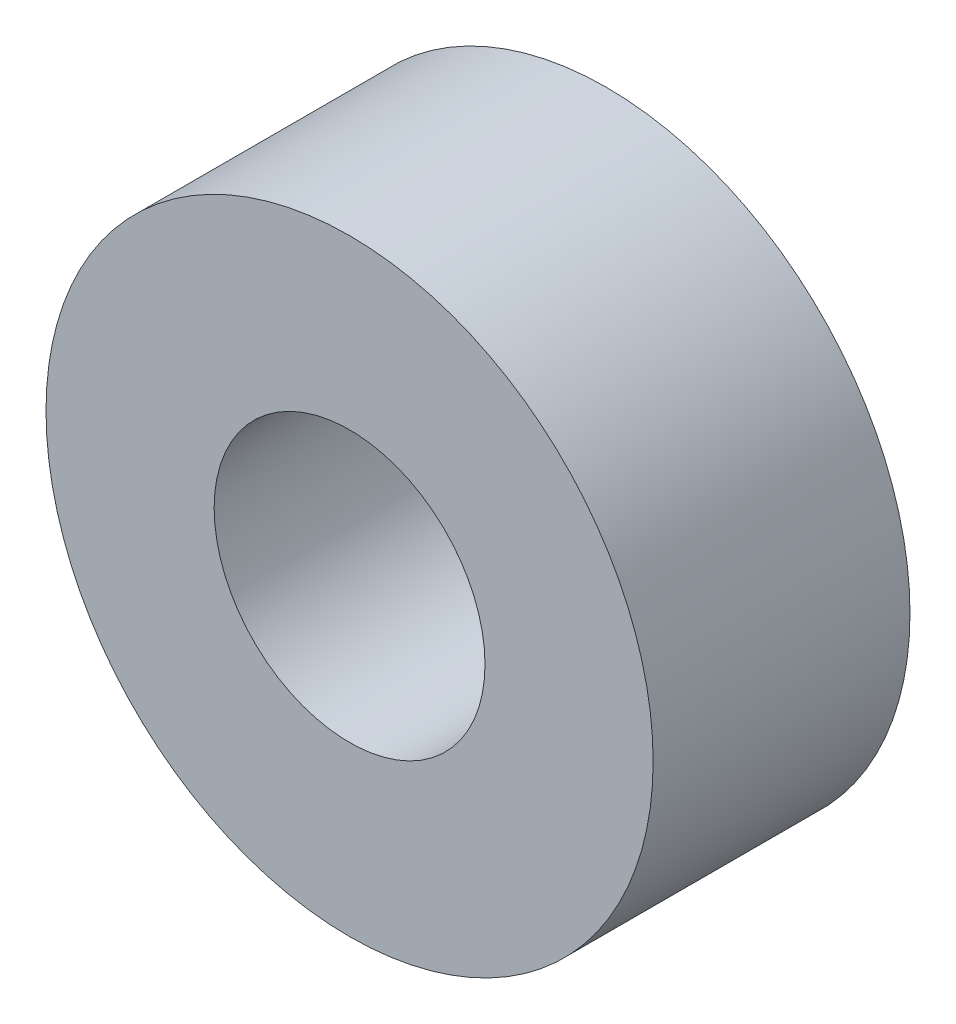
ISO-10303-21;
HEADER;
FILE_DESCRIPTION(('STEP AP214'),'2;1');
FILE_NAME('part.step','',(''),(''),'','','');
FILE_SCHEMA(('AUTOMOTIVE_DESIGN { 1 0 10303 214 1 1 1 1 }'));
ENDSEC;
DATA;
#1=APPLICATION_CONTEXT('core data for automotive mechanical design processes');
#2=APPLICATION_PROTOCOL_DEFINITION('international standard','automotive_design',2000,#1);
#3=PRODUCT_CONTEXT('',#1,'mechanical');
#4=PRODUCT('Part','Part','',(#3));
#5=PRODUCT_RELATED_PRODUCT_CATEGORY('part','',(#4));
#6=PRODUCT_DEFINITION_FORMATION('','',#4);
#7=PRODUCT_DEFINITION_CONTEXT('part definition',#1,'design');
#8=PRODUCT_DEFINITION('design','',#6,#7);
#9=PRODUCT_DEFINITION_SHAPE('','',#8);
#10=(LENGTH_UNIT() NAMED_UNIT(*) SI_UNIT(.MILLI.,.METRE.));
#11=(NAMED_UNIT(*) PLANE_ANGLE_UNIT() SI_UNIT($,.RADIAN.));
#12=(NAMED_UNIT(*) SI_UNIT($,.STERADIAN.) SOLID_ANGLE_UNIT());
#13=UNCERTAINTY_MEASURE_WITH_UNIT(LENGTH_MEASURE(1.E-05),#10,'distance_accuracy_value','');
#14=(GEOMETRIC_REPRESENTATION_CONTEXT(3) GLOBAL_UNCERTAINTY_ASSIGNED_CONTEXT((#13)) GLOBAL_UNIT_ASSIGNED_CONTEXT((#10,
#11,#12)) REPRESENTATION_CONTEXT('',''));
#15=CARTESIAN_POINT('',(0.,0.,0.));
#16=DIRECTION('',(0.,0.,1.));
#17=DIRECTION('',(1.,0.,0.));
#18=AXIS2_PLACEMENT_3D('',#15,#16,#17);
#19=CARTESIAN_POINT('',(0.,0.,5.5));
#20=DIRECTION('',(0.,0.,1.));
#21=DIRECTION('',(1.,0.,0.));
#22=AXIS2_PLACEMENT_3D('',#19,#20,#21);
#23=PLANE('',#22);
#24=CARTESIAN_POINT('',(0.,0.,5.5));
#25=DIRECTION('',(0.,0.,1.));
#26=DIRECTION('',(1.,0.,0.));
#27=AXIS2_PLACEMENT_3D('',#24,#25,#26);
#28=CIRCLE('',#27,6.5);
#29=CARTESIAN_POINT('',(6.5,0.,5.5));
#30=VERTEX_POINT('',#29);
#31=EDGE_CURVE('E10',#30,#30,#28,.T.);
#32=ORIENTED_EDGE('',*,*,#31,.T.);
#33=EDGE_LOOP('',(#32));
#34=FACE_BOUND('',#33,.T.);
#35=CARTESIAN_POINT('',(0.,0.,5.5));
#36=DIRECTION('',(0.,0.,1.));
#37=DIRECTION('',(1.,0.,0.));
#38=AXIS2_PLACEMENT_3D('',#35,#36,#37);
#39=CIRCLE('',#38,2.9);
#40=CARTESIAN_POINT('',(2.9,0.,5.5));
#41=VERTEX_POINT('',#40);
#42=EDGE_CURVE('E46',#41,#41,#39,.T.);
#43=ORIENTED_EDGE('',*,*,#42,.F.);
#44=EDGE_LOOP('',(#43));
#45=FACE_BOUND('',#44,.T.);
#46=ADVANCED_FACE('F35',(#34,#45),#23,.T.);
#47=CARTESIAN_POINT('',(0.,0.,0.));
#48=DIRECTION('',(0.,0.,1.));
#49=DIRECTION('',(1.,0.,0.));
#50=AXIS2_PLACEMENT_3D('',#47,#48,#49);
#51=PLANE('',#50);
#52=CARTESIAN_POINT('',(0.,0.,0.));
#53=DIRECTION('',(0.,0.,1.));
#54=DIRECTION('',(1.,0.,0.));
#55=AXIS2_PLACEMENT_3D('',#52,#53,#54);
#56=CIRCLE('',#55,6.5);
#57=CARTESIAN_POINT('',(6.5,0.,0.));
#58=VERTEX_POINT('',#57);
#59=EDGE_CURVE('E39',#58,#58,#56,.T.);
#60=ORIENTED_EDGE('',*,*,#59,.F.);
#61=EDGE_LOOP('',(#60));
#62=FACE_BOUND('',#61,.T.);
#63=CARTESIAN_POINT('',(0.,0.,0.));
#64=DIRECTION('',(0.,0.,1.));
#65=DIRECTION('',(1.,0.,0.));
#66=AXIS2_PLACEMENT_3D('',#63,#64,#65);
#67=CIRCLE('',#66,2.9);
#68=CARTESIAN_POINT('',(2.9,0.,0.));
#69=VERTEX_POINT('',#68);
#70=EDGE_CURVE('E48',#69,#69,#67,.T.);
#71=ORIENTED_EDGE('',*,*,#70,.T.);
#72=EDGE_LOOP('',(#71));
#73=FACE_BOUND('',#72,.T.);
#74=ADVANCED_FACE('F58',(#62,#73),#51,.F.);
#75=CARTESIAN_POINT('',(0.,0.,5.5));
#76=DIRECTION('',(0.,0.,-1.));
#77=DIRECTION('',(-1.,0.,0.));
#78=AXIS2_PLACEMENT_3D('',#75,#76,#77);
#79=CYLINDRICAL_SURFACE('',#78,6.5);
#80=ORIENTED_EDGE('',*,*,#31,.F.);
#81=EDGE_LOOP('',(#80));
#82=FACE_BOUND('',#81,.T.);
#83=ORIENTED_EDGE('',*,*,#59,.T.);
#84=EDGE_LOOP('',(#83));
#85=FACE_BOUND('',#84,.T.);
#86=ADVANCED_FACE('F37',(#82,#85),#79,.T.);
#87=CARTESIAN_POINT('',(0.,0.,5.5));
#88=DIRECTION('',(0.,0.,-1.));
#89=DIRECTION('',(-1.,0.,0.));
#90=AXIS2_PLACEMENT_3D('',#87,#88,#89);
#91=CYLINDRICAL_SURFACE('',#90,2.9);
#92=ORIENTED_EDGE('',*,*,#42,.T.);
#93=EDGE_LOOP('',(#92));
#94=FACE_BOUND('',#93,.T.);
#95=ORIENTED_EDGE('',*,*,#70,.F.);
#96=EDGE_LOOP('',(#95));
#97=FACE_BOUND('',#96,.T.);
#98=ADVANCED_FACE('F54',(#94,#97),#91,.F.);
#99=CLOSED_SHELL('',(#46,#74,#86,#98));
#100=MANIFOLD_SOLID_BREP('B2',#99);
#101=ADVANCED_BREP_SHAPE_REPRESENTATION('',(#18,#100),#14);
#102=SHAPE_DEFINITION_REPRESENTATION(#9,#101);
ENDSEC;
END-ISO-10303-21;
